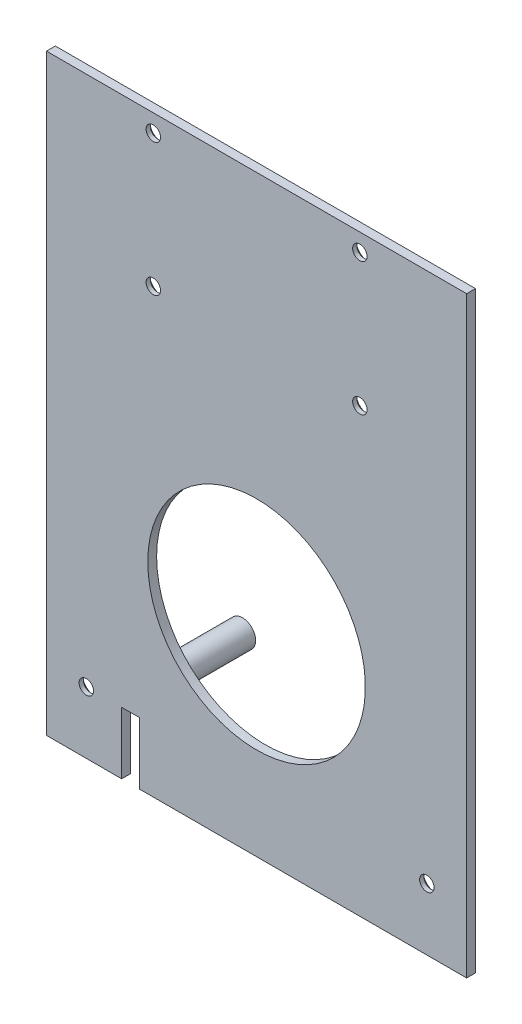
ISO-10303-21;
HEADER;
FILE_DESCRIPTION(('STEP AP214'),'2;1');
FILE_NAME('part.step','',(''),(''),'','','');
FILE_SCHEMA(('AUTOMOTIVE_DESIGN { 1 0 10303 214 1 1 1 1 }'));
ENDSEC;
DATA;
#1=APPLICATION_CONTEXT('core data for automotive mechanical design processes');
#2=APPLICATION_PROTOCOL_DEFINITION('international standard','automotive_design',2000,#1);
#3=PRODUCT_CONTEXT('',#1,'mechanical');
#4=PRODUCT('Part','Part','',(#3));
#5=PRODUCT_RELATED_PRODUCT_CATEGORY('part','',(#4));
#6=PRODUCT_DEFINITION_FORMATION('','',#4);
#7=PRODUCT_DEFINITION_CONTEXT('part definition',#1,'design');
#8=PRODUCT_DEFINITION('design','',#6,#7);
#9=PRODUCT_DEFINITION_SHAPE('','',#8);
#10=(LENGTH_UNIT() NAMED_UNIT(*) SI_UNIT(.MILLI.,.METRE.));
#11=(NAMED_UNIT(*) PLANE_ANGLE_UNIT() SI_UNIT($,.RADIAN.));
#12=(NAMED_UNIT(*) SI_UNIT($,.STERADIAN.) SOLID_ANGLE_UNIT());
#13=UNCERTAINTY_MEASURE_WITH_UNIT(LENGTH_MEASURE(1.E-05),#10,'distance_accuracy_value','');
#14=(GEOMETRIC_REPRESENTATION_CONTEXT(3) GLOBAL_UNCERTAINTY_ASSIGNED_CONTEXT((#13)) GLOBAL_UNIT_ASSIGNED_CONTEXT((#10,
#11,#12)) REPRESENTATION_CONTEXT('',''));
#15=CARTESIAN_POINT('',(0.,0.,0.));
#16=DIRECTION('',(0.,0.,1.));
#17=DIRECTION('',(1.,0.,0.));
#18=AXIS2_PLACEMENT_3D('',#15,#16,#17);
#19=CARTESIAN_POINT('',(0.,0.,2.));
#20=DIRECTION('',(0.,1.,0.));
#21=DIRECTION('',(0.,0.,1.));
#22=AXIS2_PLACEMENT_3D('',#19,#20,#21);
#23=PLANE('',#22);
#24=DIRECTION('',(1.,0.,0.));
#25=VECTOR('',#24,1.);
#26=CARTESIAN_POINT('',(0.,0.,0.));
#27=LINE('',#26,#25);
#28=CARTESIAN_POINT('',(0.,0.,0.));
#29=VERTEX_POINT('',#28);
#30=CARTESIAN_POINT('',(17.,0.,0.));
#31=VERTEX_POINT('',#30);
#32=EDGE_CURVE('E262',#29,#31,#27,.T.);
#33=ORIENTED_EDGE('',*,*,#32,.T.);
#34=DIRECTION('',(0.,0.,-1.));
#35=VECTOR('',#34,1.);
#36=CARTESIAN_POINT('',(17.,0.,2.));
#37=LINE('',#36,#35);
#38=CARTESIAN_POINT('',(17.,0.,2.));
#39=VERTEX_POINT('',#38);
#40=EDGE_CURVE('E136',#39,#31,#37,.T.);
#41=ORIENTED_EDGE('',*,*,#40,.F.);
#42=DIRECTION('',(1.,0.,0.));
#43=VECTOR('',#42,1.);
#44=CARTESIAN_POINT('',(0.,0.,2.));
#45=LINE('',#44,#43);
#46=CARTESIAN_POINT('',(0.,0.,2.));
#47=VERTEX_POINT('',#46);
#48=EDGE_CURVE('E89',#47,#39,#45,.T.);
#49=ORIENTED_EDGE('',*,*,#48,.F.);
#50=DIRECTION('',(0.,0.,-1.));
#51=VECTOR('',#50,1.);
#52=CARTESIAN_POINT('',(0.,0.,2.));
#53=LINE('',#52,#51);
#54=EDGE_CURVE('E11',#47,#29,#53,.T.);
#55=ORIENTED_EDGE('',*,*,#54,.T.);
#56=EDGE_LOOP('',(#33,#41,#49,#55));
#57=FACE_BOUND('',#56,.T.);
#58=ADVANCED_FACE('F37',(#57),#23,.F.);
#59=CARTESIAN_POINT('',(0.,0.,2.));
#60=DIRECTION('',(1.,0.,0.));
#61=DIRECTION('',(0.,0.,-1.));
#62=AXIS2_PLACEMENT_3D('',#59,#60,#61);
#63=PLANE('',#62);
#64=DIRECTION('',(0.,-1.,0.));
#65=VECTOR('',#64,1.);
#66=CARTESIAN_POINT('',(0.,0.,0.));
#67=LINE('',#66,#65);
#68=CARTESIAN_POINT('',(0.,134.,0.));
#69=VERTEX_POINT('',#68);
#70=EDGE_CURVE('E250',#69,#29,#67,.T.);
#71=ORIENTED_EDGE('',*,*,#70,.T.);
#72=ORIENTED_EDGE('',*,*,#54,.F.);
#73=DIRECTION('',(0.,-1.,0.));
#74=VECTOR('',#73,1.);
#75=CARTESIAN_POINT('',(0.,0.,2.));
#76=LINE('',#75,#74);
#77=CARTESIAN_POINT('',(0.,134.,2.));
#78=VERTEX_POINT('',#77);
#79=EDGE_CURVE('E251',#78,#47,#76,.T.);
#80=ORIENTED_EDGE('',*,*,#79,.F.);
#81=DIRECTION('',(0.,0.,-1.));
#82=VECTOR('',#81,1.);
#83=CARTESIAN_POINT('',(0.,134.,2.));
#84=LINE('',#83,#82);
#85=EDGE_CURVE('E258',#78,#69,#84,.T.);
#86=ORIENTED_EDGE('',*,*,#85,.T.);
#87=EDGE_LOOP('',(#71,#72,#80,#86));
#88=FACE_BOUND('',#87,.T.);
#89=ADVANCED_FACE('F39',(#88),#63,.F.);
#90=CARTESIAN_POINT('',(21.,0.,2.));
#91=VERTEX_POINT('',#90);
#92=CARTESIAN_POINT('',(95.,0.,2.));
#93=VERTEX_POINT('',#92);
#94=EDGE_CURVE('E253',#91,#93,#45,.T.);
#95=ORIENTED_EDGE('',*,*,#94,.F.);
#96=DIRECTION('',(0.,0.,-1.));
#97=VECTOR('',#96,1.);
#98=CARTESIAN_POINT('',(21.,0.,2.));
#99=LINE('',#98,#97);
#100=CARTESIAN_POINT('',(21.,0.,0.));
#101=VERTEX_POINT('',#100);
#102=EDGE_CURVE('E139',#91,#101,#99,.T.);
#103=ORIENTED_EDGE('',*,*,#102,.T.);
#104=CARTESIAN_POINT('',(95.,0.,0.));
#105=VERTEX_POINT('',#104);
#106=EDGE_CURVE('E261',#101,#105,#27,.T.);
#107=ORIENTED_EDGE('',*,*,#106,.T.);
#108=DIRECTION('',(0.,0.,-1.));
#109=VECTOR('',#108,1.);
#110=CARTESIAN_POINT('',(95.,0.,2.));
#111=LINE('',#110,#109);
#112=EDGE_CURVE('E45',#93,#105,#111,.T.);
#113=ORIENTED_EDGE('',*,*,#112,.F.);
#114=EDGE_LOOP('',(#95,#103,#107,#113));
#115=FACE_BOUND('',#114,.T.);
#116=ADVANCED_FACE('F296',(#115),#23,.F.);
#117=CARTESIAN_POINT('',(95.,0.,2.));
#118=DIRECTION('',(-1.,0.,0.));
#119=DIRECTION('',(0.,0.,1.));
#120=AXIS2_PLACEMENT_3D('',#117,#118,#119);
#121=PLANE('',#120);
#122=DIRECTION('',(0.,1.,0.));
#123=VECTOR('',#122,1.);
#124=CARTESIAN_POINT('',(95.,0.,0.));
#125=LINE('',#124,#123);
#126=CARTESIAN_POINT('',(95.,134.,0.));
#127=VERTEX_POINT('',#126);
#128=EDGE_CURVE('E265',#105,#127,#125,.T.);
#129=ORIENTED_EDGE('',*,*,#128,.T.);
#130=DIRECTION('',(0.,0.,-1.));
#131=VECTOR('',#130,1.);
#132=CARTESIAN_POINT('',(95.,134.,2.));
#133=LINE('',#132,#131);
#134=CARTESIAN_POINT('',(95.,134.,2.));
#135=VERTEX_POINT('',#134);
#136=EDGE_CURVE('E269',#135,#127,#133,.T.);
#137=ORIENTED_EDGE('',*,*,#136,.F.);
#138=DIRECTION('',(0.,1.,0.));
#139=VECTOR('',#138,1.);
#140=CARTESIAN_POINT('',(95.,0.,2.));
#141=LINE('',#140,#139);
#142=EDGE_CURVE('E255',#93,#135,#141,.T.);
#143=ORIENTED_EDGE('',*,*,#142,.F.);
#144=ORIENTED_EDGE('',*,*,#112,.T.);
#145=EDGE_LOOP('',(#129,#137,#143,#144));
#146=FACE_BOUND('',#145,.T.);
#147=ADVANCED_FACE('F275',(#146),#121,.F.);
#148=CARTESIAN_POINT('',(0.,134.,2.));
#149=DIRECTION('',(0.,-1.,0.));
#150=DIRECTION('',(0.,0.,-1.));
#151=AXIS2_PLACEMENT_3D('',#148,#149,#150);
#152=PLANE('',#151);
#153=DIRECTION('',(-1.,0.,0.));
#154=VECTOR('',#153,1.);
#155=CARTESIAN_POINT('',(0.,134.,0.));
#156=LINE('',#155,#154);
#157=EDGE_CURVE('E82',#127,#69,#156,.T.);
#158=ORIENTED_EDGE('',*,*,#157,.T.);
#159=ORIENTED_EDGE('',*,*,#85,.F.);
#160=DIRECTION('',(-1.,0.,0.));
#161=VECTOR('',#160,1.);
#162=CARTESIAN_POINT('',(0.,134.,2.));
#163=LINE('',#162,#161);
#164=EDGE_CURVE('E61',#135,#78,#163,.T.);
#165=ORIENTED_EDGE('',*,*,#164,.F.);
#166=ORIENTED_EDGE('',*,*,#136,.T.);
#167=EDGE_LOOP('',(#158,#159,#165,#166));
#168=FACE_BOUND('',#167,.T.);
#169=ADVANCED_FACE('F288',(#168),#152,.F.);
#170=CARTESIAN_POINT('',(0.,0.,2.));
#171=DIRECTION('',(0.,0.,-1.));
#172=DIRECTION('',(-1.,0.,0.));
#173=AXIS2_PLACEMENT_3D('',#170,#171,#172);
#174=PLANE('',#173);
#175=ORIENTED_EDGE('',*,*,#48,.T.);
#176=DIRECTION('',(0.,1.,0.));
#177=VECTOR('',#176,1.);
#178=CARTESIAN_POINT('',(17.,0.,2.));
#179=LINE('',#178,#177);
#180=CARTESIAN_POINT('',(17.,14.,2.));
#181=VERTEX_POINT('',#180);
#182=EDGE_CURVE('E113',#39,#181,#179,.T.);
#183=ORIENTED_EDGE('',*,*,#182,.T.);
#184=DIRECTION('',(1.,0.,0.));
#185=VECTOR('',#184,1.);
#186=CARTESIAN_POINT('',(17.,14.,2.));
#187=LINE('',#186,#185);
#188=CARTESIAN_POINT('',(21.,14.,2.));
#189=VERTEX_POINT('',#188);
#190=EDGE_CURVE('E121',#181,#189,#187,.T.);
#191=ORIENTED_EDGE('',*,*,#190,.T.);
#192=DIRECTION('',(0.,-1.,0.));
#193=VECTOR('',#192,1.);
#194=CARTESIAN_POINT('',(21.,0.,2.));
#195=LINE('',#194,#193);
#196=EDGE_CURVE('E118',#189,#91,#195,.T.);
#197=ORIENTED_EDGE('',*,*,#196,.T.);
#198=ORIENTED_EDGE('',*,*,#94,.T.);
#199=ORIENTED_EDGE('',*,*,#142,.T.);
#200=ORIENTED_EDGE('',*,*,#164,.T.);
#201=ORIENTED_EDGE('',*,*,#79,.T.);
#202=EDGE_LOOP('',(#175,#183,#191,#197,#198,#199,#200,#201));
#203=FACE_BOUND('',#202,.T.);
#204=CARTESIAN_POINT('',(47.5,45.5,2.));
#205=DIRECTION('',(0.,0.,-1.));
#206=DIRECTION('',(-1.,0.,0.));
#207=AXIS2_PLACEMENT_3D('',#204,#205,#206);
#208=CIRCLE('',#207,24.6);
#209=CARTESIAN_POINT('',(22.9,45.5,2.));
#210=VERTEX_POINT('',#209);
#211=EDGE_CURVE('E191',#210,#210,#208,.T.);
#212=ORIENTED_EDGE('',*,*,#211,.T.);
#213=EDGE_LOOP('',(#212));
#214=FACE_BOUND('',#213,.T.);
#215=CARTESIAN_POINT('',(70.85,130.,2.));
#216=DIRECTION('',(0.,0.,-1.));
#217=DIRECTION('',(-1.,0.,0.));
#218=AXIS2_PLACEMENT_3D('',#215,#216,#217);
#219=CIRCLE('',#218,1.63194999999999);
#220=CARTESIAN_POINT('',(69.21805,130.,2.));
#221=VERTEX_POINT('',#220);
#222=EDGE_CURVE('E202',#221,#221,#219,.T.);
#223=ORIENTED_EDGE('',*,*,#222,.T.);
#224=EDGE_LOOP('',(#223));
#225=FACE_BOUND('',#224,.T.);
#226=CARTESIAN_POINT('',(24.15,130.,2.));
#227=DIRECTION('',(0.,0.,-1.));
#228=DIRECTION('',(-1.,0.,0.));
#229=AXIS2_PLACEMENT_3D('',#226,#227,#228);
#230=CIRCLE('',#229,1.63195);
#231=CARTESIAN_POINT('',(22.51805,130.,2.));
#232=VERTEX_POINT('',#231);
#233=EDGE_CURVE('E211',#232,#232,#230,.T.);
#234=ORIENTED_EDGE('',*,*,#233,.T.);
#235=EDGE_LOOP('',(#234));
#236=FACE_BOUND('',#235,.T.);
#237=CARTESIAN_POINT('',(24.15,100.,2.));
#238=DIRECTION('',(0.,0.,-1.));
#239=DIRECTION('',(-1.,0.,0.));
#240=AXIS2_PLACEMENT_3D('',#237,#238,#239);
#241=CIRCLE('',#240,1.63195);
#242=CARTESIAN_POINT('',(22.51805,100.,2.));
#243=VERTEX_POINT('',#242);
#244=EDGE_CURVE('E220',#243,#243,#241,.T.);
#245=ORIENTED_EDGE('',*,*,#244,.T.);
#246=EDGE_LOOP('',(#245));
#247=FACE_BOUND('',#246,.T.);
#248=CARTESIAN_POINT('',(70.85,100.,2.));
#249=DIRECTION('',(0.,0.,-1.));
#250=DIRECTION('',(-1.,0.,0.));
#251=AXIS2_PLACEMENT_3D('',#248,#249,#250);
#252=CIRCLE('',#251,1.63194999999999);
#253=CARTESIAN_POINT('',(69.21805,100.,2.));
#254=VERTEX_POINT('',#253);
#255=EDGE_CURVE('E229',#254,#254,#252,.T.);
#256=ORIENTED_EDGE('',*,*,#255,.T.);
#257=EDGE_LOOP('',(#256));
#258=FACE_BOUND('',#257,.T.);
#259=CARTESIAN_POINT('',(86.,14.,2.));
#260=DIRECTION('',(0.,0.,-1.));
#261=DIRECTION('',(-1.,0.,0.));
#262=AXIS2_PLACEMENT_3D('',#259,#260,#261);
#263=CIRCLE('',#262,1.63194999999999);
#264=CARTESIAN_POINT('',(84.36805,14.,2.));
#265=VERTEX_POINT('',#264);
#266=EDGE_CURVE('E238',#265,#265,#263,.T.);
#267=ORIENTED_EDGE('',*,*,#266,.T.);
#268=EDGE_LOOP('',(#267));
#269=FACE_BOUND('',#268,.T.);
#270=CARTESIAN_POINT('',(9.00000000000001,14.,2.));
#271=DIRECTION('',(0.,0.,-1.));
#272=DIRECTION('',(-1.,0.,0.));
#273=AXIS2_PLACEMENT_3D('',#270,#271,#272);
#274=CIRCLE('',#273,1.63195);
#275=CARTESIAN_POINT('',(7.36805000000001,14.,2.));
#276=VERTEX_POINT('',#275);
#277=EDGE_CURVE('E247',#276,#276,#274,.T.);
#278=ORIENTED_EDGE('',*,*,#277,.T.);
#279=EDGE_LOOP('',(#278));
#280=FACE_BOUND('',#279,.T.);
#281=ADVANCED_FACE('F126',(#203,#214,#225,#236,#247,#258,#269,#280),#174,.F.);
#282=CARTESIAN_POINT('',(0.,0.,0.));
#283=DIRECTION('',(0.,0.,-1.));
#284=DIRECTION('',(-1.,0.,0.));
#285=AXIS2_PLACEMENT_3D('',#282,#283,#284);
#286=PLANE('',#285);
#287=DIRECTION('',(0.,1.,0.));
#288=VECTOR('',#287,1.);
#289=CARTESIAN_POINT('',(17.,0.,0.));
#290=LINE('',#289,#288);
#291=CARTESIAN_POINT('',(17.,14.,0.));
#292=VERTEX_POINT('',#291);
#293=EDGE_CURVE('E52',#31,#292,#290,.T.);
#294=ORIENTED_EDGE('',*,*,#293,.F.);
#295=ORIENTED_EDGE('',*,*,#32,.F.);
#296=ORIENTED_EDGE('',*,*,#70,.F.);
#297=ORIENTED_EDGE('',*,*,#157,.F.);
#298=ORIENTED_EDGE('',*,*,#128,.F.);
#299=ORIENTED_EDGE('',*,*,#106,.F.);
#300=DIRECTION('',(0.,-1.,0.));
#301=VECTOR('',#300,1.);
#302=CARTESIAN_POINT('',(21.,0.,0.));
#303=LINE('',#302,#301);
#304=CARTESIAN_POINT('',(21.,14.,0.));
#305=VERTEX_POINT('',#304);
#306=EDGE_CURVE('E128',#305,#101,#303,.T.);
#307=ORIENTED_EDGE('',*,*,#306,.F.);
#308=DIRECTION('',(1.,0.,0.));
#309=VECTOR('',#308,1.);
#310=CARTESIAN_POINT('',(17.,14.,0.));
#311=LINE('',#310,#309);
#312=EDGE_CURVE('E130',#292,#305,#311,.T.);
#313=ORIENTED_EDGE('',*,*,#312,.F.);
#314=EDGE_LOOP('',(#294,#295,#296,#297,#298,#299,#307,#313));
#315=FACE_BOUND('',#314,.T.);
#316=CARTESIAN_POINT('',(23.,20.9,0.));
#317=DIRECTION('',(0.,0.,-1.));
#318=DIRECTION('',(-1.,0.,0.));
#319=AXIS2_PLACEMENT_3D('',#316,#317,#318);
#320=CIRCLE('',#319,3.);
#321=CARTESIAN_POINT('',(20.,20.9,0.));
#322=VERTEX_POINT('',#321);
#323=EDGE_CURVE('E164',#322,#322,#320,.T.);
#324=ORIENTED_EDGE('',*,*,#323,.F.);
#325=EDGE_LOOP('',(#324));
#326=FACE_BOUND('',#325,.T.);
#327=CARTESIAN_POINT('',(72.,20.9,0.));
#328=DIRECTION('',(0.,0.,-1.));
#329=DIRECTION('',(-1.,0.,0.));
#330=AXIS2_PLACEMENT_3D('',#327,#328,#329);
#331=CIRCLE('',#330,3.00000000000001);
#332=CARTESIAN_POINT('',(69.,20.9,0.));
#333=VERTEX_POINT('',#332);
#334=EDGE_CURVE('E170',#333,#333,#331,.T.);
#335=ORIENTED_EDGE('',*,*,#334,.F.);
#336=EDGE_LOOP('',(#335));
#337=FACE_BOUND('',#336,.T.);
#338=CARTESIAN_POINT('',(23.,70.1,0.));
#339=DIRECTION('',(0.,0.,-1.));
#340=DIRECTION('',(-1.,0.,0.));
#341=AXIS2_PLACEMENT_3D('',#338,#339,#340);
#342=CIRCLE('',#341,3.);
#343=CARTESIAN_POINT('',(20.,70.1,0.));
#344=VERTEX_POINT('',#343);
#345=EDGE_CURVE('E176',#344,#344,#342,.T.);
#346=ORIENTED_EDGE('',*,*,#345,.F.);
#347=EDGE_LOOP('',(#346));
#348=FACE_BOUND('',#347,.T.);
#349=CARTESIAN_POINT('',(72.,70.1,0.));
#350=DIRECTION('',(0.,0.,-1.));
#351=DIRECTION('',(-1.,0.,0.));
#352=AXIS2_PLACEMENT_3D('',#349,#350,#351);
#353=CIRCLE('',#352,3.00000000000001);
#354=CARTESIAN_POINT('',(69.,70.1,0.));
#355=VERTEX_POINT('',#354);
#356=EDGE_CURVE('E182',#355,#355,#353,.T.);
#357=ORIENTED_EDGE('',*,*,#356,.F.);
#358=EDGE_LOOP('',(#357));
#359=FACE_BOUND('',#358,.T.);
#360=CARTESIAN_POINT('',(47.5,45.5,0.));
#361=DIRECTION('',(0.,0.,-1.));
#362=DIRECTION('',(-1.,0.,0.));
#363=AXIS2_PLACEMENT_3D('',#360,#361,#362);
#364=CIRCLE('',#363,24.6);
#365=CARTESIAN_POINT('',(22.9,45.5,0.));
#366=VERTEX_POINT('',#365);
#367=EDGE_CURVE('E188',#366,#366,#364,.T.);
#368=ORIENTED_EDGE('',*,*,#367,.F.);
#369=EDGE_LOOP('',(#368));
#370=FACE_BOUND('',#369,.T.);
#371=CARTESIAN_POINT('',(70.85,130.,0.));
#372=DIRECTION('',(0.,0.,-1.));
#373=DIRECTION('',(-1.,0.,0.));
#374=AXIS2_PLACEMENT_3D('',#371,#372,#373);
#375=CIRCLE('',#374,2.8575);
#376=CARTESIAN_POINT('',(67.9925,130.,0.));
#377=VERTEX_POINT('',#376);
#378=EDGE_CURVE('E194',#377,#377,#375,.T.);
#379=ORIENTED_EDGE('',*,*,#378,.F.);
#380=EDGE_LOOP('',(#379));
#381=FACE_BOUND('',#380,.T.);
#382=CARTESIAN_POINT('',(24.15,130.,0.));
#383=DIRECTION('',(0.,0.,-1.));
#384=DIRECTION('',(-1.,0.,0.));
#385=AXIS2_PLACEMENT_3D('',#382,#383,#384);
#386=CIRCLE('',#385,2.8575);
#387=CARTESIAN_POINT('',(21.2925,130.,0.));
#388=VERTEX_POINT('',#387);
#389=EDGE_CURVE('E205',#388,#388,#386,.T.);
#390=ORIENTED_EDGE('',*,*,#389,.F.);
#391=EDGE_LOOP('',(#390));
#392=FACE_BOUND('',#391,.T.);
#393=CARTESIAN_POINT('',(24.15,100.,0.));
#394=DIRECTION('',(0.,0.,-1.));
#395=DIRECTION('',(-1.,0.,0.));
#396=AXIS2_PLACEMENT_3D('',#393,#394,#395);
#397=CIRCLE('',#396,2.8575);
#398=CARTESIAN_POINT('',(21.2925,100.,0.));
#399=VERTEX_POINT('',#398);
#400=EDGE_CURVE('E214',#399,#399,#397,.T.);
#401=ORIENTED_EDGE('',*,*,#400,.F.);
#402=EDGE_LOOP('',(#401));
#403=FACE_BOUND('',#402,.T.);
#404=CARTESIAN_POINT('',(70.85,100.,0.));
#405=DIRECTION('',(0.,0.,-1.));
#406=DIRECTION('',(-1.,0.,0.));
#407=AXIS2_PLACEMENT_3D('',#404,#405,#406);
#408=CIRCLE('',#407,2.8575);
#409=CARTESIAN_POINT('',(67.9925,100.,0.));
#410=VERTEX_POINT('',#409);
#411=EDGE_CURVE('E223',#410,#410,#408,.T.);
#412=ORIENTED_EDGE('',*,*,#411,.F.);
#413=EDGE_LOOP('',(#412));
#414=FACE_BOUND('',#413,.T.);
#415=CARTESIAN_POINT('',(86.,14.,0.));
#416=DIRECTION('',(0.,0.,-1.));
#417=DIRECTION('',(-1.,0.,0.));
#418=AXIS2_PLACEMENT_3D('',#415,#416,#417);
#419=CIRCLE('',#418,2.8575);
#420=CARTESIAN_POINT('',(83.1425,14.,0.));
#421=VERTEX_POINT('',#420);
#422=EDGE_CURVE('E232',#421,#421,#419,.T.);
#423=ORIENTED_EDGE('',*,*,#422,.F.);
#424=EDGE_LOOP('',(#423));
#425=FACE_BOUND('',#424,.T.);
#426=CARTESIAN_POINT('',(9.00000000000001,14.,0.));
#427=DIRECTION('',(0.,0.,-1.));
#428=DIRECTION('',(-1.,0.,0.));
#429=AXIS2_PLACEMENT_3D('',#426,#427,#428);
#430=CIRCLE('',#429,2.8575);
#431=CARTESIAN_POINT('',(6.14250000000001,14.,0.));
#432=VERTEX_POINT('',#431);
#433=EDGE_CURVE('E241',#432,#432,#430,.T.);
#434=ORIENTED_EDGE('',*,*,#433,.F.);
#435=EDGE_LOOP('',(#434));
#436=FACE_BOUND('',#435,.T.);
#437=ADVANCED_FACE('F281',(#315,#326,#337,#348,#359,#370,#381,#392,#403,#414,#425,#436),#286,.T.);
#438=CARTESIAN_POINT('',(9.00000000000001,14.,0.));
#439=DIRECTION('',(0.,0.,-1.));
#440=DIRECTION('',(-1.,0.,0.));
#441=AXIS2_PLACEMENT_3D('',#438,#439,#440);
#442=CYLINDRICAL_SURFACE('',#441,1.63194999999999);
#443=ORIENTED_EDGE('',*,*,#277,.F.);
#444=EDGE_LOOP('',(#443));
#445=FACE_BOUND('',#444,.T.);
#446=CARTESIAN_POINT('',(9.00000000000001,14.,1.02835855298933));
#447=DIRECTION('',(0.,0.,-1.));
#448=DIRECTION('',(-1.,0.,0.));
#449=AXIS2_PLACEMENT_3D('',#446,#447,#448);
#450=CIRCLE('',#449,1.63194999999999);
#451=CARTESIAN_POINT('',(7.36805000000002,14.,1.02835855298933));
#452=VERTEX_POINT('',#451);
#453=EDGE_CURVE('E244',#452,#452,#450,.T.);
#454=ORIENTED_EDGE('',*,*,#453,.T.);
#455=EDGE_LOOP('',(#454));
#456=FACE_BOUND('',#455,.T.);
#457=ADVANCED_FACE('F428',(#445,#456),#442,.F.);
#458=CARTESIAN_POINT('',(9.00000000000001,14.,0.));
#459=DIRECTION('',(0.,0.,-1.));
#460=DIRECTION('',(-1.,0.,0.));
#461=AXIS2_PLACEMENT_3D('',#458,#459,#460);
#462=CONICAL_SURFACE('',#461,2.8575,0.872664625997162);
#463=ORIENTED_EDGE('',*,*,#453,.F.);
#464=EDGE_LOOP('',(#463));
#465=FACE_BOUND('',#464,.T.);
#466=ORIENTED_EDGE('',*,*,#433,.T.);
#467=EDGE_LOOP('',(#466));
#468=FACE_BOUND('',#467,.T.);
#469=ADVANCED_FACE('F424',(#465,#468),#462,.F.);
#470=CARTESIAN_POINT('',(86.,14.,0.));
#471=DIRECTION('',(0.,0.,-1.));
#472=DIRECTION('',(-1.,0.,0.));
#473=AXIS2_PLACEMENT_3D('',#470,#471,#472);
#474=CYLINDRICAL_SURFACE('',#473,1.63194999999999);
#475=ORIENTED_EDGE('',*,*,#266,.F.);
#476=EDGE_LOOP('',(#475));
#477=FACE_BOUND('',#476,.T.);
#478=CARTESIAN_POINT('',(86.,14.,1.02835855298933));
#479=DIRECTION('',(0.,0.,-1.));
#480=DIRECTION('',(-1.,0.,0.));
#481=AXIS2_PLACEMENT_3D('',#478,#479,#480);
#482=CIRCLE('',#481,1.63194999999999);
#483=CARTESIAN_POINT('',(84.36805,14.,1.02835855298933));
#484=VERTEX_POINT('',#483);
#485=EDGE_CURVE('E235',#484,#484,#482,.T.);
#486=ORIENTED_EDGE('',*,*,#485,.T.);
#487=EDGE_LOOP('',(#486));
#488=FACE_BOUND('',#487,.T.);
#489=ADVANCED_FACE('F420',(#477,#488),#474,.F.);
#490=CARTESIAN_POINT('',(86.,14.,0.));
#491=DIRECTION('',(0.,0.,-1.));
#492=DIRECTION('',(-1.,0.,0.));
#493=AXIS2_PLACEMENT_3D('',#490,#491,#492);
#494=CONICAL_SURFACE('',#493,2.8575,0.87266462599716);
#495=ORIENTED_EDGE('',*,*,#485,.F.);
#496=EDGE_LOOP('',(#495));
#497=FACE_BOUND('',#496,.T.);
#498=ORIENTED_EDGE('',*,*,#422,.T.);
#499=EDGE_LOOP('',(#498));
#500=FACE_BOUND('',#499,.T.);
#501=ADVANCED_FACE('F416',(#497,#500),#494,.F.);
#502=CARTESIAN_POINT('',(70.85,100.,0.));
#503=DIRECTION('',(0.,0.,-1.));
#504=DIRECTION('',(-1.,0.,0.));
#505=AXIS2_PLACEMENT_3D('',#502,#503,#504);
#506=CYLINDRICAL_SURFACE('',#505,1.63194999999999);
#507=ORIENTED_EDGE('',*,*,#255,.F.);
#508=EDGE_LOOP('',(#507));
#509=FACE_BOUND('',#508,.T.);
#510=CARTESIAN_POINT('',(70.85,100.,1.02835855298933));
#511=DIRECTION('',(0.,0.,-1.));
#512=DIRECTION('',(-1.,0.,0.));
#513=AXIS2_PLACEMENT_3D('',#510,#511,#512);
#514=CIRCLE('',#513,1.63194999999999);
#515=CARTESIAN_POINT('',(69.21805,100.,1.02835855298933));
#516=VERTEX_POINT('',#515);
#517=EDGE_CURVE('E226',#516,#516,#514,.T.);
#518=ORIENTED_EDGE('',*,*,#517,.T.);
#519=EDGE_LOOP('',(#518));
#520=FACE_BOUND('',#519,.T.);
#521=ADVANCED_FACE('F412',(#509,#520),#506,.F.);
#522=CARTESIAN_POINT('',(70.85,100.,0.));
#523=DIRECTION('',(0.,0.,-1.));
#524=DIRECTION('',(-1.,0.,0.));
#525=AXIS2_PLACEMENT_3D('',#522,#523,#524);
#526=CONICAL_SURFACE('',#525,2.8575,0.87266462599716);
#527=ORIENTED_EDGE('',*,*,#517,.F.);
#528=EDGE_LOOP('',(#527));
#529=FACE_BOUND('',#528,.T.);
#530=ORIENTED_EDGE('',*,*,#411,.T.);
#531=EDGE_LOOP('',(#530));
#532=FACE_BOUND('',#531,.T.);
#533=ADVANCED_FACE('F408',(#529,#532),#526,.F.);
#534=CARTESIAN_POINT('',(24.15,100.,0.));
#535=DIRECTION('',(0.,0.,-1.));
#536=DIRECTION('',(-1.,0.,0.));
#537=AXIS2_PLACEMENT_3D('',#534,#535,#536);
#538=CYLINDRICAL_SURFACE('',#537,1.63194999999999);
#539=ORIENTED_EDGE('',*,*,#244,.F.);
#540=EDGE_LOOP('',(#539));
#541=FACE_BOUND('',#540,.T.);
#542=CARTESIAN_POINT('',(24.15,100.,1.02835855298933));
#543=DIRECTION('',(0.,0.,-1.));
#544=DIRECTION('',(-1.,0.,0.));
#545=AXIS2_PLACEMENT_3D('',#542,#543,#544);
#546=CIRCLE('',#545,1.63194999999999);
#547=CARTESIAN_POINT('',(22.51805,100.,1.02835855298933));
#548=VERTEX_POINT('',#547);
#549=EDGE_CURVE('E217',#548,#548,#546,.T.);
#550=ORIENTED_EDGE('',*,*,#549,.T.);
#551=EDGE_LOOP('',(#550));
#552=FACE_BOUND('',#551,.T.);
#553=ADVANCED_FACE('F404',(#541,#552),#538,.F.);
#554=CARTESIAN_POINT('',(24.15,100.,0.));
#555=DIRECTION('',(0.,0.,-1.));
#556=DIRECTION('',(-1.,0.,0.));
#557=AXIS2_PLACEMENT_3D('',#554,#555,#556);
#558=CONICAL_SURFACE('',#557,2.8575,0.872664625997163);
#559=ORIENTED_EDGE('',*,*,#549,.F.);
#560=EDGE_LOOP('',(#559));
#561=FACE_BOUND('',#560,.T.);
#562=ORIENTED_EDGE('',*,*,#400,.T.);
#563=EDGE_LOOP('',(#562));
#564=FACE_BOUND('',#563,.T.);
#565=ADVANCED_FACE('F400',(#561,#564),#558,.F.);
#566=CARTESIAN_POINT('',(24.15,130.,0.));
#567=DIRECTION('',(0.,0.,-1.));
#568=DIRECTION('',(-1.,0.,0.));
#569=AXIS2_PLACEMENT_3D('',#566,#567,#568);
#570=CYLINDRICAL_SURFACE('',#569,1.63194999999999);
#571=ORIENTED_EDGE('',*,*,#233,.F.);
#572=EDGE_LOOP('',(#571));
#573=FACE_BOUND('',#572,.T.);
#574=CARTESIAN_POINT('',(24.15,130.,1.02835855298933));
#575=DIRECTION('',(0.,0.,-1.));
#576=DIRECTION('',(-1.,0.,0.));
#577=AXIS2_PLACEMENT_3D('',#574,#575,#576);
#578=CIRCLE('',#577,1.63194999999999);
#579=CARTESIAN_POINT('',(22.51805,130.,1.02835855298933));
#580=VERTEX_POINT('',#579);
#581=EDGE_CURVE('E208',#580,#580,#578,.T.);
#582=ORIENTED_EDGE('',*,*,#581,.T.);
#583=EDGE_LOOP('',(#582));
#584=FACE_BOUND('',#583,.T.);
#585=ADVANCED_FACE('F396',(#573,#584),#570,.F.);
#586=CARTESIAN_POINT('',(24.15,130.,0.));
#587=DIRECTION('',(0.,0.,-1.));
#588=DIRECTION('',(-1.,0.,0.));
#589=AXIS2_PLACEMENT_3D('',#586,#587,#588);
#590=CONICAL_SURFACE('',#589,2.8575,0.872664625997163);
#591=ORIENTED_EDGE('',*,*,#581,.F.);
#592=EDGE_LOOP('',(#591));
#593=FACE_BOUND('',#592,.T.);
#594=ORIENTED_EDGE('',*,*,#389,.T.);
#595=EDGE_LOOP('',(#594));
#596=FACE_BOUND('',#595,.T.);
#597=ADVANCED_FACE('F392',(#593,#596),#590,.F.);
#598=CARTESIAN_POINT('',(70.85,130.,0.));
#599=DIRECTION('',(0.,0.,-1.));
#600=DIRECTION('',(-1.,0.,0.));
#601=AXIS2_PLACEMENT_3D('',#598,#599,#600);
#602=CYLINDRICAL_SURFACE('',#601,1.63194999999999);
#603=ORIENTED_EDGE('',*,*,#222,.F.);
#604=EDGE_LOOP('',(#603));
#605=FACE_BOUND('',#604,.T.);
#606=CARTESIAN_POINT('',(70.85,130.,1.02835855298933));
#607=DIRECTION('',(0.,0.,-1.));
#608=DIRECTION('',(-1.,0.,0.));
#609=AXIS2_PLACEMENT_3D('',#606,#607,#608);
#610=CIRCLE('',#609,1.63194999999999);
#611=CARTESIAN_POINT('',(69.21805,130.,1.02835855298933));
#612=VERTEX_POINT('',#611);
#613=EDGE_CURVE('E199',#612,#612,#610,.T.);
#614=ORIENTED_EDGE('',*,*,#613,.T.);
#615=EDGE_LOOP('',(#614));
#616=FACE_BOUND('',#615,.T.);
#617=ADVANCED_FACE('F388',(#605,#616),#602,.F.);
#618=CARTESIAN_POINT('',(70.85,130.,0.));
#619=DIRECTION('',(0.,0.,-1.));
#620=DIRECTION('',(-1.,0.,0.));
#621=AXIS2_PLACEMENT_3D('',#618,#619,#620);
#622=CONICAL_SURFACE('',#621,2.8575,0.87266462599716);
#623=ORIENTED_EDGE('',*,*,#613,.F.);
#624=EDGE_LOOP('',(#623));
#625=FACE_BOUND('',#624,.T.);
#626=ORIENTED_EDGE('',*,*,#378,.T.);
#627=EDGE_LOOP('',(#626));
#628=FACE_BOUND('',#627,.T.);
#629=ADVANCED_FACE('F384',(#625,#628),#622,.F.);
#630=CARTESIAN_POINT('',(47.5,45.5,2.));
#631=DIRECTION('',(0.,0.,-1.));
#632=DIRECTION('',(-1.,0.,0.));
#633=AXIS2_PLACEMENT_3D('',#630,#631,#632);
#634=CYLINDRICAL_SURFACE('',#633,24.6);
#635=ORIENTED_EDGE('',*,*,#211,.F.);
#636=EDGE_LOOP('',(#635));
#637=FACE_BOUND('',#636,.T.);
#638=ORIENTED_EDGE('',*,*,#367,.T.);
#639=EDGE_LOOP('',(#638));
#640=FACE_BOUND('',#639,.T.);
#641=ADVANCED_FACE('F380',(#637,#640),#634,.F.);
#642=CARTESIAN_POINT('',(72.,70.1,-19.3));
#643=DIRECTION('',(0.,0.,1.));
#644=DIRECTION('',(1.,0.,0.));
#645=AXIS2_PLACEMENT_3D('',#642,#643,#644);
#646=CYLINDRICAL_SURFACE('',#645,3.00000000000001);
#647=CARTESIAN_POINT('',(72.,70.1,-19.3));
#648=DIRECTION('',(0.,0.,-1.));
#649=DIRECTION('',(-1.,0.,0.));
#650=AXIS2_PLACEMENT_3D('',#647,#648,#649);
#651=CIRCLE('',#650,3.00000000000001);
#652=CARTESIAN_POINT('',(69.,70.1,-19.3));
#653=VERTEX_POINT('',#652);
#654=EDGE_CURVE('E185',#653,#653,#651,.T.);
#655=ORIENTED_EDGE('',*,*,#654,.F.);
#656=EDGE_LOOP('',(#655));
#657=FACE_BOUND('',#656,.T.);
#658=ORIENTED_EDGE('',*,*,#356,.T.);
#659=EDGE_LOOP('',(#658));
#660=FACE_BOUND('',#659,.T.);
#661=ADVANCED_FACE('F376',(#657,#660),#646,.T.);
#662=CARTESIAN_POINT('',(72.,70.1,-19.3));
#663=DIRECTION('',(0.,0.,-1.));
#664=DIRECTION('',(-1.,0.,0.));
#665=AXIS2_PLACEMENT_3D('',#662,#663,#664);
#666=PLANE('',#665);
#667=CARTESIAN_POINT('',(72.,70.1,-19.3));
#668=DIRECTION('',(0.,0.,-1.));
#669=DIRECTION('',(-1.,0.,0.));
#670=AXIS2_PLACEMENT_3D('',#667,#668,#669);
#671=CIRCLE('',#670,1.15);
#672=CARTESIAN_POINT('',(70.85,70.1,-19.3));
#673=VERTEX_POINT('',#672);
#674=EDGE_CURVE('E146',#673,#673,#671,.T.);
#675=ORIENTED_EDGE('',*,*,#674,.F.);
#676=EDGE_LOOP('',(#675));
#677=FACE_BOUND('',#676,.T.);
#678=ORIENTED_EDGE('',*,*,#654,.T.);
#679=EDGE_LOOP('',(#678));
#680=FACE_BOUND('',#679,.T.);
#681=ADVANCED_FACE('F372',(#677,#680),#666,.T.);
#682=CARTESIAN_POINT('',(23.,70.1,-19.3));
#683=DIRECTION('',(0.,0.,1.));
#684=DIRECTION('',(1.,0.,0.));
#685=AXIS2_PLACEMENT_3D('',#682,#683,#684);
#686=CYLINDRICAL_SURFACE('',#685,3.);
#687=CARTESIAN_POINT('',(23.,70.1,-19.3));
#688=DIRECTION('',(0.,0.,-1.));
#689=DIRECTION('',(-1.,0.,0.));
#690=AXIS2_PLACEMENT_3D('',#687,#688,#689);
#691=CIRCLE('',#690,3.);
#692=CARTESIAN_POINT('',(20.,70.1,-19.3));
#693=VERTEX_POINT('',#692);
#694=EDGE_CURVE('E179',#693,#693,#691,.T.);
#695=ORIENTED_EDGE('',*,*,#694,.F.);
#696=EDGE_LOOP('',(#695));
#697=FACE_BOUND('',#696,.T.);
#698=ORIENTED_EDGE('',*,*,#345,.T.);
#699=EDGE_LOOP('',(#698));
#700=FACE_BOUND('',#699,.T.);
#701=ADVANCED_FACE('F368',(#697,#700),#686,.T.);
#702=CARTESIAN_POINT('',(23.,70.1,-19.3));
#703=DIRECTION('',(0.,0.,-1.));
#704=DIRECTION('',(-1.,0.,0.));
#705=AXIS2_PLACEMENT_3D('',#702,#703,#704);
#706=PLANE('',#705);
#707=CARTESIAN_POINT('',(23.,70.1,-19.3));
#708=DIRECTION('',(0.,0.,-1.));
#709=DIRECTION('',(-1.,0.,0.));
#710=AXIS2_PLACEMENT_3D('',#707,#708,#709);
#711=CIRCLE('',#710,1.15);
#712=CARTESIAN_POINT('',(21.85,70.1,-19.3));
#713=VERTEX_POINT('',#712);
#714=EDGE_CURVE('E147',#713,#713,#711,.T.);
#715=ORIENTED_EDGE('',*,*,#714,.F.);
#716=EDGE_LOOP('',(#715));
#717=FACE_BOUND('',#716,.T.);
#718=ORIENTED_EDGE('',*,*,#694,.T.);
#719=EDGE_LOOP('',(#718));
#720=FACE_BOUND('',#719,.T.);
#721=ADVANCED_FACE('F364',(#717,#720),#706,.T.);
#722=CARTESIAN_POINT('',(72.,20.9,-19.3));
#723=DIRECTION('',(0.,0.,1.));
#724=DIRECTION('',(1.,0.,0.));
#725=AXIS2_PLACEMENT_3D('',#722,#723,#724);
#726=CYLINDRICAL_SURFACE('',#725,3.00000000000001);
#727=CARTESIAN_POINT('',(72.,20.9,-19.3));
#728=DIRECTION('',(0.,0.,-1.));
#729=DIRECTION('',(-1.,0.,0.));
#730=AXIS2_PLACEMENT_3D('',#727,#728,#729);
#731=CIRCLE('',#730,3.00000000000001);
#732=CARTESIAN_POINT('',(69.,20.9,-19.3));
#733=VERTEX_POINT('',#732);
#734=EDGE_CURVE('E173',#733,#733,#731,.T.);
#735=ORIENTED_EDGE('',*,*,#734,.F.);
#736=EDGE_LOOP('',(#735));
#737=FACE_BOUND('',#736,.T.);
#738=ORIENTED_EDGE('',*,*,#334,.T.);
#739=EDGE_LOOP('',(#738));
#740=FACE_BOUND('',#739,.T.);
#741=ADVANCED_FACE('F360',(#737,#740),#726,.T.);
#742=CARTESIAN_POINT('',(72.,20.9,-19.3));
#743=DIRECTION('',(0.,0.,-1.));
#744=DIRECTION('',(-1.,0.,0.));
#745=AXIS2_PLACEMENT_3D('',#742,#743,#744);
#746=PLANE('',#745);
#747=CARTESIAN_POINT('',(72.,20.9,-19.3));
#748=DIRECTION('',(0.,0.,-1.));
#749=DIRECTION('',(-1.,0.,0.));
#750=AXIS2_PLACEMENT_3D('',#747,#748,#749);
#751=CIRCLE('',#750,1.15);
#752=CARTESIAN_POINT('',(70.85,20.9,-19.3));
#753=VERTEX_POINT('',#752);
#754=EDGE_CURVE('E138',#753,#753,#751,.T.);
#755=ORIENTED_EDGE('',*,*,#754,.F.);
#756=EDGE_LOOP('',(#755));
#757=FACE_BOUND('',#756,.T.);
#758=ORIENTED_EDGE('',*,*,#734,.T.);
#759=EDGE_LOOP('',(#758));
#760=FACE_BOUND('',#759,.T.);
#761=ADVANCED_FACE('F356',(#757,#760),#746,.T.);
#762=CARTESIAN_POINT('',(23.,20.9,-19.3));
#763=DIRECTION('',(0.,0.,1.));
#764=DIRECTION('',(1.,0.,0.));
#765=AXIS2_PLACEMENT_3D('',#762,#763,#764);
#766=CYLINDRICAL_SURFACE('',#765,3.);
#767=CARTESIAN_POINT('',(23.,20.9,-19.3));
#768=DIRECTION('',(0.,0.,-1.));
#769=DIRECTION('',(-1.,0.,0.));
#770=AXIS2_PLACEMENT_3D('',#767,#768,#769);
#771=CIRCLE('',#770,3.);
#772=CARTESIAN_POINT('',(20.,20.9,-19.3));
#773=VERTEX_POINT('',#772);
#774=EDGE_CURVE('E167',#773,#773,#771,.T.);
#775=ORIENTED_EDGE('',*,*,#774,.F.);
#776=EDGE_LOOP('',(#775));
#777=FACE_BOUND('',#776,.T.);
#778=ORIENTED_EDGE('',*,*,#323,.T.);
#779=EDGE_LOOP('',(#778));
#780=FACE_BOUND('',#779,.T.);
#781=ADVANCED_FACE('F352',(#777,#780),#766,.T.);
#782=CARTESIAN_POINT('',(23.,20.9,-19.3));
#783=DIRECTION('',(0.,0.,-1.));
#784=DIRECTION('',(-1.,0.,0.));
#785=AXIS2_PLACEMENT_3D('',#782,#783,#784);
#786=PLANE('',#785);
#787=CARTESIAN_POINT('',(23.,20.9,-19.3));
#788=DIRECTION('',(0.,0.,-1.));
#789=DIRECTION('',(-1.,0.,0.));
#790=AXIS2_PLACEMENT_3D('',#787,#788,#789);
#791=CIRCLE('',#790,1.15);
#792=CARTESIAN_POINT('',(21.85,20.9,-19.3));
#793=VERTEX_POINT('',#792);
#794=EDGE_CURVE('E153',#793,#793,#791,.T.);
#795=ORIENTED_EDGE('',*,*,#794,.F.);
#796=EDGE_LOOP('',(#795));
#797=FACE_BOUND('',#796,.T.);
#798=ORIENTED_EDGE('',*,*,#774,.T.);
#799=EDGE_LOOP('',(#798));
#800=FACE_BOUND('',#799,.T.);
#801=ADVANCED_FACE('F336',(#797,#800),#786,.T.);
#802=CARTESIAN_POINT('',(23.,20.9,-4.3));
#803=DIRECTION('',(0.,0.,-1.));
#804=DIRECTION('',(-1.,0.,0.));
#805=AXIS2_PLACEMENT_3D('',#802,#803,#804);
#806=CYLINDRICAL_SURFACE('',#805,1.15);
#807=CARTESIAN_POINT('',(23.,20.9,-4.3));
#808=DIRECTION('',(0.,0.,-1.));
#809=DIRECTION('',(-1.,0.,0.));
#810=AXIS2_PLACEMENT_3D('',#807,#808,#809);
#811=CIRCLE('',#810,1.15);
#812=CARTESIAN_POINT('',(21.85,20.9,-4.3));
#813=VERTEX_POINT('',#812);
#814=EDGE_CURVE('E150',#813,#813,#811,.T.);
#815=ORIENTED_EDGE('',*,*,#814,.F.);
#816=EDGE_LOOP('',(#815));
#817=FACE_BOUND('',#816,.T.);
#818=ORIENTED_EDGE('',*,*,#794,.T.);
#819=EDGE_LOOP('',(#818));
#820=FACE_BOUND('',#819,.T.);
#821=ADVANCED_FACE('F332',(#817,#820),#806,.F.);
#822=CARTESIAN_POINT('',(23.,20.9,-4.3));
#823=DIRECTION('',(0.,0.,-1.));
#824=DIRECTION('',(-1.,0.,0.));
#825=AXIS2_PLACEMENT_3D('',#822,#823,#824);
#826=PLANE('',#825);
#827=ORIENTED_EDGE('',*,*,#814,.T.);
#828=EDGE_LOOP('',(#827));
#829=FACE_BOUND('',#828,.T.);
#830=ADVANCED_FACE('F328',(#829),#826,.T.);
#831=CARTESIAN_POINT('',(72.,20.9,-4.3));
#832=DIRECTION('',(0.,0.,-1.));
#833=DIRECTION('',(-1.,0.,0.));
#834=AXIS2_PLACEMENT_3D('',#831,#832,#833);
#835=CYLINDRICAL_SURFACE('',#834,1.15);
#836=CARTESIAN_POINT('',(72.,20.9,-4.3));
#837=DIRECTION('',(0.,0.,-1.));
#838=DIRECTION('',(-1.,0.,0.));
#839=AXIS2_PLACEMENT_3D('',#836,#837,#838);
#840=CIRCLE('',#839,1.15);
#841=CARTESIAN_POINT('',(70.85,20.9,-4.3));
#842=VERTEX_POINT('',#841);
#843=EDGE_CURVE('E156',#842,#842,#840,.T.);
#844=ORIENTED_EDGE('',*,*,#843,.F.);
#845=EDGE_LOOP('',(#844));
#846=FACE_BOUND('',#845,.T.);
#847=ORIENTED_EDGE('',*,*,#754,.T.);
#848=EDGE_LOOP('',(#847));
#849=FACE_BOUND('',#848,.T.);
#850=ADVANCED_FACE('F331',(#846,#849),#835,.F.);
#851=CARTESIAN_POINT('',(72.,20.9,-4.3));
#852=DIRECTION('',(0.,0.,-1.));
#853=DIRECTION('',(-1.,0.,0.));
#854=AXIS2_PLACEMENT_3D('',#851,#852,#853);
#855=PLANE('',#854);
#856=ORIENTED_EDGE('',*,*,#843,.T.);
#857=EDGE_LOOP('',(#856));
#858=FACE_BOUND('',#857,.T.);
#859=ADVANCED_FACE('F326',(#858),#855,.T.);
#860=CARTESIAN_POINT('',(23.,70.1,-4.3));
#861=DIRECTION('',(0.,0.,-1.));
#862=DIRECTION('',(-1.,0.,0.));
#863=AXIS2_PLACEMENT_3D('',#860,#861,#862);
#864=CYLINDRICAL_SURFACE('',#863,1.15);
#865=CARTESIAN_POINT('',(23.,70.1,-4.3));
#866=DIRECTION('',(0.,0.,-1.));
#867=DIRECTION('',(-1.,0.,0.));
#868=AXIS2_PLACEMENT_3D('',#865,#866,#867);
#869=CIRCLE('',#868,1.15);
#870=CARTESIAN_POINT('',(21.85,70.1,-4.3));
#871=VERTEX_POINT('',#870);
#872=EDGE_CURVE('E143',#871,#871,#869,.T.);
#873=ORIENTED_EDGE('',*,*,#872,.F.);
#874=EDGE_LOOP('',(#873));
#875=FACE_BOUND('',#874,.T.);
#876=ORIENTED_EDGE('',*,*,#714,.T.);
#877=EDGE_LOOP('',(#876));
#878=FACE_BOUND('',#877,.T.);
#879=ADVANCED_FACE('F322',(#875,#878),#864,.F.);
#880=CARTESIAN_POINT('',(23.,70.1,-4.3));
#881=DIRECTION('',(0.,0.,-1.));
#882=DIRECTION('',(-1.,0.,0.));
#883=AXIS2_PLACEMENT_3D('',#880,#881,#882);
#884=PLANE('',#883);
#885=ORIENTED_EDGE('',*,*,#872,.T.);
#886=EDGE_LOOP('',(#885));
#887=FACE_BOUND('',#886,.T.);
#888=ADVANCED_FACE('F318',(#887),#884,.T.);
#889=CARTESIAN_POINT('',(72.,70.1,-4.3));
#890=DIRECTION('',(0.,0.,-1.));
#891=DIRECTION('',(-1.,0.,0.));
#892=AXIS2_PLACEMENT_3D('',#889,#890,#891);
#893=CYLINDRICAL_SURFACE('',#892,1.15);
#894=CARTESIAN_POINT('',(72.,70.1,-4.3));
#895=DIRECTION('',(0.,0.,-1.));
#896=DIRECTION('',(-1.,0.,0.));
#897=AXIS2_PLACEMENT_3D('',#894,#895,#896);
#898=CIRCLE('',#897,1.15);
#899=CARTESIAN_POINT('',(70.85,70.1,-4.3));
#900=VERTEX_POINT('',#899);
#901=EDGE_CURVE('E161',#900,#900,#898,.T.);
#902=ORIENTED_EDGE('',*,*,#901,.F.);
#903=EDGE_LOOP('',(#902));
#904=FACE_BOUND('',#903,.T.);
#905=ORIENTED_EDGE('',*,*,#674,.T.);
#906=EDGE_LOOP('',(#905));
#907=FACE_BOUND('',#906,.T.);
#908=ADVANCED_FACE('F321',(#904,#907),#893,.F.);
#909=CARTESIAN_POINT('',(72.,70.1,-4.3));
#910=DIRECTION('',(0.,0.,-1.));
#911=DIRECTION('',(-1.,0.,0.));
#912=AXIS2_PLACEMENT_3D('',#909,#910,#911);
#913=PLANE('',#912);
#914=ORIENTED_EDGE('',*,*,#901,.T.);
#915=EDGE_LOOP('',(#914));
#916=FACE_BOUND('',#915,.T.);
#917=ADVANCED_FACE('F315',(#916),#913,.T.);
#918=CARTESIAN_POINT('',(17.,0.,2.));
#919=DIRECTION('',(-1.,0.,0.));
#920=DIRECTION('',(0.,0.,1.));
#921=AXIS2_PLACEMENT_3D('',#918,#919,#920);
#922=PLANE('',#921);
#923=ORIENTED_EDGE('',*,*,#293,.T.);
#924=DIRECTION('',(0.,0.,-1.));
#925=VECTOR('',#924,1.);
#926=CARTESIAN_POINT('',(17.,14.,2.));
#927=LINE('',#926,#925);
#928=EDGE_CURVE('E109',#181,#292,#927,.T.);
#929=ORIENTED_EDGE('',*,*,#928,.F.);
#930=ORIENTED_EDGE('',*,*,#182,.F.);
#931=ORIENTED_EDGE('',*,*,#40,.T.);
#932=EDGE_LOOP('',(#923,#929,#930,#931));
#933=FACE_BOUND('',#932,.T.);
#934=ADVANCED_FACE('F111',(#933),#922,.F.);
#935=CARTESIAN_POINT('',(21.,0.,2.));
#936=DIRECTION('',(1.,0.,0.));
#937=DIRECTION('',(0.,0.,-1.));
#938=AXIS2_PLACEMENT_3D('',#935,#936,#937);
#939=PLANE('',#938);
#940=ORIENTED_EDGE('',*,*,#306,.T.);
#941=ORIENTED_EDGE('',*,*,#102,.F.);
#942=ORIENTED_EDGE('',*,*,#196,.F.);
#943=DIRECTION('',(0.,0.,-1.));
#944=VECTOR('',#943,1.);
#945=CARTESIAN_POINT('',(21.,14.,2.));
#946=LINE('',#945,#944);
#947=EDGE_CURVE('E117',#189,#305,#946,.T.);
#948=ORIENTED_EDGE('',*,*,#947,.T.);
#949=EDGE_LOOP('',(#940,#941,#942,#948));
#950=FACE_BOUND('',#949,.T.);
#951=ADVANCED_FACE('F307',(#950),#939,.F.);
#952=CARTESIAN_POINT('',(17.,14.,2.));
#953=DIRECTION('',(0.,1.,0.));
#954=DIRECTION('',(-1.,0.,0.));
#955=AXIS2_PLACEMENT_3D('',#952,#953,#954);
#956=PLANE('',#955);
#957=ORIENTED_EDGE('',*,*,#312,.T.);
#958=ORIENTED_EDGE('',*,*,#947,.F.);
#959=ORIENTED_EDGE('',*,*,#190,.F.);
#960=ORIENTED_EDGE('',*,*,#928,.T.);
#961=EDGE_LOOP('',(#957,#958,#959,#960));
#962=FACE_BOUND('',#961,.T.);
#963=ADVANCED_FACE('F122',(#962),#956,.F.);
#964=CLOSED_SHELL('',(#58,#89,#116,#147,#169,#281,#437,#457,#469,#489,#501,#521,#533,#553,#565,
#585,#597,#617,#629,#641,#661,#681,#701,#721,#741,#761,#781,#801,#821,#830,#850,#859,#879,#888,
#908,#917,#934,#951,#963));
#965=MANIFOLD_SOLID_BREP('B2',#964);
#966=ADVANCED_BREP_SHAPE_REPRESENTATION('',(#18,#965),#14);
#967=SHAPE_DEFINITION_REPRESENTATION(#9,#966);
ENDSEC;
END-ISO-10303-21;
